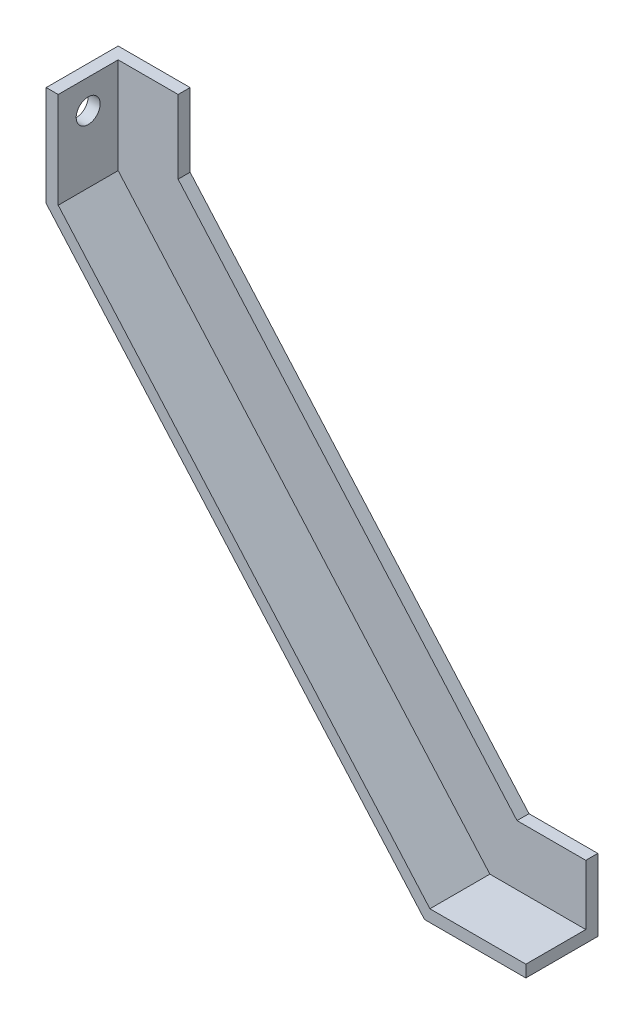
ISO-10303-21;
HEADER;
FILE_DESCRIPTION(('STEP AP214'),'2;1');
FILE_NAME('part.step','',(''),(''),'','','');
FILE_SCHEMA(('AUTOMOTIVE_DESIGN { 1 0 10303 214 1 1 1 1 }'));
ENDSEC;
DATA;
#1=APPLICATION_CONTEXT('core data for automotive mechanical design processes');
#2=APPLICATION_PROTOCOL_DEFINITION('international standard','automotive_design',2000,#1);
#3=PRODUCT_CONTEXT('',#1,'mechanical');
#4=PRODUCT('Part','Part','',(#3));
#5=PRODUCT_RELATED_PRODUCT_CATEGORY('part','',(#4));
#6=PRODUCT_DEFINITION_FORMATION('','',#4);
#7=PRODUCT_DEFINITION_CONTEXT('part definition',#1,'design');
#8=PRODUCT_DEFINITION('design','',#6,#7);
#9=PRODUCT_DEFINITION_SHAPE('','',#8);
#10=(LENGTH_UNIT() NAMED_UNIT(*) SI_UNIT(.MILLI.,.METRE.));
#11=(NAMED_UNIT(*) PLANE_ANGLE_UNIT() SI_UNIT($,.RADIAN.));
#12=(NAMED_UNIT(*) SI_UNIT($,.STERADIAN.) SOLID_ANGLE_UNIT());
#13=UNCERTAINTY_MEASURE_WITH_UNIT(LENGTH_MEASURE(1.E-05),#10,'distance_accuracy_value','');
#14=(GEOMETRIC_REPRESENTATION_CONTEXT(3) GLOBAL_UNCERTAINTY_ASSIGNED_CONTEXT((#13)) GLOBAL_UNIT_ASSIGNED_CONTEXT((#10,
#11,#12)) REPRESENTATION_CONTEXT('',''));
#15=CARTESIAN_POINT('',(0.,0.,0.));
#16=DIRECTION('',(0.,0.,1.));
#17=DIRECTION('',(1.,0.,0.));
#18=AXIS2_PLACEMENT_3D('',#15,#16,#17);
#19=CARTESIAN_POINT('',(127.,-137.517505,19.05));
#20=DIRECTION('',(0.,-1.,0.));
#21=DIRECTION('',(1.,0.,0.));
#22=AXIS2_PLACEMENT_3D('',#19,#20,#21);
#23=PLANE('',#22);
#24=DIRECTION('',(1.,0.,0.));
#25=VECTOR('',#24,1.);
#26=CARTESIAN_POINT('',(1.50270768051186E-13,-137.517505,3.175));
#27=LINE('',#26,#25);
#28=CARTESIAN_POINT('',(101.6,-137.517505,3.17500000000001));
#29=VERTEX_POINT('',#28);
#30=CARTESIAN_POINT('',(127.,-137.517505,3.17500000000001));
#31=VERTEX_POINT('',#30);
#32=EDGE_CURVE('E53',#29,#31,#27,.T.);
#33=ORIENTED_EDGE('',*,*,#32,.F.);
#34=DIRECTION('',(0.,0.,-1.));
#35=VECTOR('',#34,1.);
#36=CARTESIAN_POINT('',(101.6,-137.517505,19.05));
#37=LINE('',#36,#35);
#38=CARTESIAN_POINT('',(101.6,-137.517505,19.05));
#39=VERTEX_POINT('',#38);
#40=EDGE_CURVE('E209',#39,#29,#37,.T.);
#41=ORIENTED_EDGE('',*,*,#40,.F.);
#42=DIRECTION('',(-1.,0.,0.));
#43=VECTOR('',#42,1.);
#44=CARTESIAN_POINT('',(127.,-137.517505,19.05));
#45=LINE('',#44,#43);
#46=CARTESIAN_POINT('',(127.,-137.517505,19.05));
#47=VERTEX_POINT('',#46);
#48=EDGE_CURVE('E191',#47,#39,#45,.T.);
#49=ORIENTED_EDGE('',*,*,#48,.F.);
#50=DIRECTION('',(0.,0.,-1.));
#51=VECTOR('',#50,1.);
#52=CARTESIAN_POINT('',(127.,-137.517505,19.05));
#53=LINE('',#52,#51);
#54=EDGE_CURVE('E49',#47,#31,#53,.T.);
#55=ORIENTED_EDGE('',*,*,#54,.T.);
#56=EDGE_LOOP('',(#33,#41,#49,#55));
#57=FACE_BOUND('',#56,.T.);
#58=ADVANCED_FACE('F34',(#57),#23,.F.);
#59=CARTESIAN_POINT('',(101.6,-137.517505,19.05));
#60=DIRECTION('',(-0.751505485627988,-0.659726841254046,0.));
#61=DIRECTION('',(0.659726841254046,-0.751505485627988,0.));
#62=AXIS2_PLACEMENT_3D('',#59,#60,#61);
#63=PLANE('',#62);
#64=DIRECTION('',(0.659726841254046,-0.751505485627988,0.));
#65=VECTOR('',#64,1.);
#66=CARTESIAN_POINT('',(-10.799909270149,-9.48095544861091,3.175));
#67=LINE('',#66,#65);
#68=CARTESIAN_POINT('',(3.175,-25.4,3.17500000000001));
#69=VERTEX_POINT('',#68);
#70=EDGE_CURVE('E164',#69,#29,#67,.T.);
#71=ORIENTED_EDGE('',*,*,#70,.F.);
#72=DIRECTION('',(0.,0.,-1.));
#73=VECTOR('',#72,1.);
#74=CARTESIAN_POINT('',(3.175,-25.4,19.05));
#75=LINE('',#74,#73);
#76=CARTESIAN_POINT('',(3.175,-25.4,19.05));
#77=VERTEX_POINT('',#76);
#78=EDGE_CURVE('E206',#77,#69,#75,.T.);
#79=ORIENTED_EDGE('',*,*,#78,.F.);
#80=DIRECTION('',(-0.659726841254046,0.751505485627988,0.));
#81=VECTOR('',#80,1.);
#82=CARTESIAN_POINT('',(101.6,-137.517505,19.05));
#83=LINE('',#82,#81);
#84=EDGE_CURVE('E193',#39,#77,#83,.T.);
#85=ORIENTED_EDGE('',*,*,#84,.F.);
#86=ORIENTED_EDGE('',*,*,#40,.T.);
#87=EDGE_LOOP('',(#71,#79,#85,#86));
#88=FACE_BOUND('',#87,.T.);
#89=ADVANCED_FACE('F252',(#88),#63,.F.);
#90=CARTESIAN_POINT('',(3.175,-25.4,19.05));
#91=DIRECTION('',(-1.,0.,0.));
#92=DIRECTION('',(0.,-1.,0.));
#93=AXIS2_PLACEMENT_3D('',#90,#91,#92);
#94=PLANE('',#93);
#95=CARTESIAN_POINT('',(3.175,-7.690689216,11.1125));
#96=DIRECTION('',(1.,0.,0.));
#97=DIRECTION('',(0.,1.,0.));
#98=AXIS2_PLACEMENT_3D('',#95,#96,#97);
#99=CIRCLE('',#98,3.175);
#100=CARTESIAN_POINT('',(3.175,-4.515689216,11.1125));
#101=VERTEX_POINT('',#100);
#102=EDGE_CURVE('E155',#101,#101,#99,.T.);
#103=ORIENTED_EDGE('',*,*,#102,.F.);
#104=EDGE_LOOP('',(#103));
#105=FACE_BOUND('',#104,.T.);
#106=DIRECTION('',(0.,-1.,0.));
#107=VECTOR('',#106,1.);
#108=CARTESIAN_POINT('',(3.175,0.,3.175));
#109=LINE('',#108,#107);
#110=CARTESIAN_POINT('',(3.175,0.,3.17500000000001));
#111=VERTEX_POINT('',#110);
#112=EDGE_CURVE('E144',#111,#69,#109,.T.);
#113=ORIENTED_EDGE('',*,*,#112,.F.);
#114=DIRECTION('',(0.,0.,-1.));
#115=VECTOR('',#114,1.);
#116=CARTESIAN_POINT('',(3.175,0.,19.05));
#117=LINE('',#116,#115);
#118=CARTESIAN_POINT('',(3.175,0.,19.05));
#119=VERTEX_POINT('',#118);
#120=EDGE_CURVE('E149',#119,#111,#117,.T.);
#121=ORIENTED_EDGE('',*,*,#120,.F.);
#122=DIRECTION('',(0.,1.,0.));
#123=VECTOR('',#122,1.);
#124=CARTESIAN_POINT('',(3.175,-25.4,19.05));
#125=LINE('',#124,#123);
#126=EDGE_CURVE('E195',#77,#119,#125,.T.);
#127=ORIENTED_EDGE('',*,*,#126,.F.);
#128=ORIENTED_EDGE('',*,*,#78,.T.);
#129=EDGE_LOOP('',(#113,#121,#127,#128));
#130=FACE_BOUND('',#129,.T.);
#131=ADVANCED_FACE('F256',(#105,#130),#94,.F.);
#132=CARTESIAN_POINT('',(3.175,0.,19.05));
#133=DIRECTION('',(0.,-1.,0.));
#134=DIRECTION('',(0.,0.,-1.));
#135=AXIS2_PLACEMENT_3D('',#132,#133,#134);
#136=PLANE('',#135);
#137=DIRECTION('',(-1.,0.,0.));
#138=VECTOR('',#137,1.);
#139=CARTESIAN_POINT('',(3.175,0.,0.));
#140=LINE('',#139,#138);
#141=CARTESIAN_POINT('',(19.05,0.,0.));
#142=VERTEX_POINT('',#141);
#143=CARTESIAN_POINT('',(0.,0.,0.));
#144=VERTEX_POINT('',#143);
#145=EDGE_CURVE('E174',#142,#144,#140,.T.);
#146=ORIENTED_EDGE('',*,*,#145,.T.);
#147=DIRECTION('',(0.,0.,-1.));
#148=VECTOR('',#147,1.);
#149=CARTESIAN_POINT('',(0.,0.,19.05));
#150=LINE('',#149,#148);
#151=CARTESIAN_POINT('',(0.,0.,19.05));
#152=VERTEX_POINT('',#151);
#153=EDGE_CURVE('E11',#152,#144,#150,.T.);
#154=ORIENTED_EDGE('',*,*,#153,.F.);
#155=DIRECTION('',(-1.,0.,0.));
#156=VECTOR('',#155,1.);
#157=CARTESIAN_POINT('',(3.175,0.,19.05));
#158=LINE('',#157,#156);
#159=EDGE_CURVE('E179',#119,#152,#158,.T.);
#160=ORIENTED_EDGE('',*,*,#159,.F.);
#161=ORIENTED_EDGE('',*,*,#120,.T.);
#162=DIRECTION('',(-1.,0.,0.));
#163=VECTOR('',#162,1.);
#164=CARTESIAN_POINT('',(0.,0.,3.175));
#165=LINE('',#164,#163);
#166=CARTESIAN_POINT('',(19.05,0.,3.175));
#167=VERTEX_POINT('',#166);
#168=EDGE_CURVE('E128',#167,#111,#165,.T.);
#169=ORIENTED_EDGE('',*,*,#168,.F.);
#170=DIRECTION('',(0.,0.,-1.));
#171=VECTOR('',#170,1.);
#172=CARTESIAN_POINT('',(19.05,0.,3.175));
#173=LINE('',#172,#171);
#174=EDGE_CURVE('E137',#167,#142,#173,.T.);
#175=ORIENTED_EDGE('',*,*,#174,.T.);
#176=EDGE_LOOP('',(#146,#154,#160,#161,#169,#175));
#177=FACE_BOUND('',#176,.T.);
#178=ADVANCED_FACE('F36',(#177),#136,.F.);
#179=CARTESIAN_POINT('',(0.,0.,19.05));
#180=DIRECTION('',(1.,0.,0.));
#181=DIRECTION('',(0.,1.,0.));
#182=AXIS2_PLACEMENT_3D('',#179,#180,#181);
#183=PLANE('',#182);
#184=CARTESIAN_POINT('',(0.,-7.690689216,11.1125));
#185=DIRECTION('',(1.,0.,0.));
#186=DIRECTION('',(0.,1.,0.));
#187=AXIS2_PLACEMENT_3D('',#184,#185,#186);
#188=CIRCLE('',#187,3.175);
#189=CARTESIAN_POINT('',(0.,-4.515689216,11.1125));
#190=VERTEX_POINT('',#189);
#191=EDGE_CURVE('E169',#190,#190,#188,.T.);
#192=ORIENTED_EDGE('',*,*,#191,.T.);
#193=EDGE_LOOP('',(#192));
#194=FACE_BOUND('',#193,.T.);
#195=DIRECTION('',(0.,-1.,0.));
#196=VECTOR('',#195,1.);
#197=CARTESIAN_POINT('',(0.,0.,0.));
#198=LINE('',#197,#196);
#199=CARTESIAN_POINT('',(0.,-26.595904173962,0.));
#200=VERTEX_POINT('',#199);
#201=EDGE_CURVE('E198',#144,#200,#198,.T.);
#202=ORIENTED_EDGE('',*,*,#201,.T.);
#203=DIRECTION('',(0.,0.,-1.));
#204=VECTOR('',#203,1.);
#205=CARTESIAN_POINT('',(0.,-26.595904173962,19.05));
#206=LINE('',#205,#204);
#207=CARTESIAN_POINT('',(0.,-26.595904173962,19.05));
#208=VERTEX_POINT('',#207);
#209=EDGE_CURVE('E42',#208,#200,#206,.T.);
#210=ORIENTED_EDGE('',*,*,#209,.F.);
#211=DIRECTION('',(0.,-1.,0.));
#212=VECTOR('',#211,1.);
#213=CARTESIAN_POINT('',(0.,0.,19.05));
#214=LINE('',#213,#212);
#215=EDGE_CURVE('E182',#152,#208,#214,.T.);
#216=ORIENTED_EDGE('',*,*,#215,.F.);
#217=ORIENTED_EDGE('',*,*,#153,.T.);
#218=EDGE_LOOP('',(#202,#210,#216,#217));
#219=FACE_BOUND('',#218,.T.);
#220=ADVANCED_FACE('F242',(#194,#219),#183,.F.);
#221=CARTESIAN_POINT('',(0.,-26.595904173962,19.05));
#222=DIRECTION('',(0.751505485627988,0.659726841254046,0.));
#223=DIRECTION('',(-0.659726841254046,0.751505485627988,0.));
#224=AXIS2_PLACEMENT_3D('',#221,#222,#223);
#225=PLANE('',#224);
#226=DIRECTION('',(0.659726841254046,-0.751505485627988,0.));
#227=VECTOR('',#226,1.);
#228=CARTESIAN_POINT('',(0.,-26.595904173962,0.));
#229=LINE('',#228,#227);
#230=CARTESIAN_POINT('',(100.162396017489,-140.692505,0.));
#231=VERTEX_POINT('',#230);
#232=EDGE_CURVE('E200',#200,#231,#229,.T.);
#233=ORIENTED_EDGE('',*,*,#232,.T.);
#234=DIRECTION('',(0.,0.,-1.));
#235=VECTOR('',#234,1.);
#236=CARTESIAN_POINT('',(100.162396017489,-140.692505,19.05));
#237=LINE('',#236,#235);
#238=CARTESIAN_POINT('',(100.162396017489,-140.692505,19.05));
#239=VERTEX_POINT('',#238);
#240=EDGE_CURVE('E215',#239,#231,#237,.T.);
#241=ORIENTED_EDGE('',*,*,#240,.F.);
#242=DIRECTION('',(0.659726841254046,-0.751505485627988,0.));
#243=VECTOR('',#242,1.);
#244=CARTESIAN_POINT('',(0.,-26.595904173962,19.05));
#245=LINE('',#244,#243);
#246=EDGE_CURVE('E185',#208,#239,#245,.T.);
#247=ORIENTED_EDGE('',*,*,#246,.F.);
#248=ORIENTED_EDGE('',*,*,#209,.T.);
#249=EDGE_LOOP('',(#233,#241,#247,#248));
#250=FACE_BOUND('',#249,.T.);
#251=ADVANCED_FACE('F222',(#250),#225,.F.);
#252=CARTESIAN_POINT('',(100.162396017489,-140.692505,19.05));
#253=DIRECTION('',(0.,1.,0.));
#254=DIRECTION('',(0.,0.,1.));
#255=AXIS2_PLACEMENT_3D('',#252,#253,#254);
#256=PLANE('',#255);
#257=DIRECTION('',(1.,0.,0.));
#258=VECTOR('',#257,1.);
#259=CARTESIAN_POINT('',(100.162396017489,-140.692505,0.));
#260=LINE('',#259,#258);
#261=CARTESIAN_POINT('',(127.,-140.692505,0.));
#262=VERTEX_POINT('',#261);
#263=EDGE_CURVE('E202',#231,#262,#260,.T.);
#264=ORIENTED_EDGE('',*,*,#263,.T.);
#265=DIRECTION('',(0.,0.,-1.));
#266=VECTOR('',#265,1.);
#267=CARTESIAN_POINT('',(127.,-140.692505,19.05));
#268=LINE('',#267,#266);
#269=CARTESIAN_POINT('',(127.,-140.692505,19.05));
#270=VERTEX_POINT('',#269);
#271=EDGE_CURVE('E212',#270,#262,#268,.T.);
#272=ORIENTED_EDGE('',*,*,#271,.F.);
#273=DIRECTION('',(1.,0.,0.));
#274=VECTOR('',#273,1.);
#275=CARTESIAN_POINT('',(100.162396017489,-140.692505,19.05));
#276=LINE('',#275,#274);
#277=EDGE_CURVE('E187',#239,#270,#276,.T.);
#278=ORIENTED_EDGE('',*,*,#277,.F.);
#279=ORIENTED_EDGE('',*,*,#240,.T.);
#280=EDGE_LOOP('',(#264,#272,#278,#279));
#281=FACE_BOUND('',#280,.T.);
#282=ADVANCED_FACE('F232',(#281),#256,.F.);
#283=CARTESIAN_POINT('',(127.,-140.692505,19.05));
#284=DIRECTION('',(-1.,0.,0.));
#285=DIRECTION('',(0.,0.,1.));
#286=AXIS2_PLACEMENT_3D('',#283,#284,#285);
#287=PLANE('',#286);
#288=DIRECTION('',(0.,1.,0.));
#289=VECTOR('',#288,1.);
#290=CARTESIAN_POINT('',(127.,-140.692505,0.));
#291=LINE('',#290,#289);
#292=CARTESIAN_POINT('',(127.,-121.642505,0.));
#293=VERTEX_POINT('',#292);
#294=EDGE_CURVE('E183',#262,#293,#291,.T.);
#295=ORIENTED_EDGE('',*,*,#294,.T.);
#296=DIRECTION('',(0.,0.,-1.));
#297=VECTOR('',#296,1.);
#298=CARTESIAN_POINT('',(127.,-121.642505,3.175));
#299=LINE('',#298,#297);
#300=CARTESIAN_POINT('',(127.,-121.642505,3.175));
#301=VERTEX_POINT('',#300);
#302=EDGE_CURVE('E171',#301,#293,#299,.T.);
#303=ORIENTED_EDGE('',*,*,#302,.F.);
#304=DIRECTION('',(0.,1.,0.));
#305=VECTOR('',#304,1.);
#306=CARTESIAN_POINT('',(127.,0.,3.175));
#307=LINE('',#306,#305);
#308=EDGE_CURVE('E161',#31,#301,#307,.T.);
#309=ORIENTED_EDGE('',*,*,#308,.F.);
#310=ORIENTED_EDGE('',*,*,#54,.F.);
#311=DIRECTION('',(0.,1.,0.));
#312=VECTOR('',#311,1.);
#313=CARTESIAN_POINT('',(127.,-140.692505,19.05));
#314=LINE('',#313,#312);
#315=EDGE_CURVE('E189',#270,#47,#314,.T.);
#316=ORIENTED_EDGE('',*,*,#315,.F.);
#317=ORIENTED_EDGE('',*,*,#271,.T.);
#318=EDGE_LOOP('',(#295,#303,#309,#310,#316,#317));
#319=FACE_BOUND('',#318,.T.);
#320=ADVANCED_FACE('F236',(#319),#287,.F.);
#321=CARTESIAN_POINT('',(0.,0.,19.05));
#322=DIRECTION('',(0.,0.,1.));
#323=DIRECTION('',(1.,0.,0.));
#324=AXIS2_PLACEMENT_3D('',#321,#322,#323);
#325=PLANE('',#324);
#326=ORIENTED_EDGE('',*,*,#159,.T.);
#327=ORIENTED_EDGE('',*,*,#215,.T.);
#328=ORIENTED_EDGE('',*,*,#246,.T.);
#329=ORIENTED_EDGE('',*,*,#277,.T.);
#330=ORIENTED_EDGE('',*,*,#315,.T.);
#331=ORIENTED_EDGE('',*,*,#48,.T.);
#332=ORIENTED_EDGE('',*,*,#84,.T.);
#333=ORIENTED_EDGE('',*,*,#126,.T.);
#334=EDGE_LOOP('',(#326,#327,#328,#329,#330,#331,#332,#333));
#335=FACE_BOUND('',#334,.T.);
#336=ADVANCED_FACE('F240',(#335),#325,.T.);
#337=CARTESIAN_POINT('',(0.,0.,0.));
#338=DIRECTION('',(0.,0.,1.));
#339=DIRECTION('',(1.,0.,0.));
#340=AXIS2_PLACEMENT_3D('',#337,#338,#339);
#341=PLANE('',#340);
#342=ORIENTED_EDGE('',*,*,#145,.F.);
#343=DIRECTION('',(0.,1.,0.));
#344=VECTOR('',#343,1.);
#345=CARTESIAN_POINT('',(19.05,0.,0.));
#346=LINE('',#345,#344);
#347=CARTESIAN_POINT('',(19.05,-19.420479130185,0.));
#348=VERTEX_POINT('',#347);
#349=EDGE_CURVE('E140',#348,#142,#346,.T.);
#350=ORIENTED_EDGE('',*,*,#349,.F.);
#351=DIRECTION('',(-0.659726841254046,0.751505485627988,0.));
#352=VECTOR('',#351,1.);
#353=CARTESIAN_POINT('',(1.13024031419536,0.992208156297076,0.));
#354=LINE('',#353,#352);
#355=CARTESIAN_POINT('',(108.78801991256,-121.642505,0.));
#356=VERTEX_POINT('',#355);
#357=EDGE_CURVE('E152',#356,#348,#354,.T.);
#358=ORIENTED_EDGE('',*,*,#357,.F.);
#359=DIRECTION('',(-1.,0.,0.));
#360=VECTOR('',#359,1.);
#361=CARTESIAN_POINT('',(0.,-121.642505,0.));
#362=LINE('',#361,#360);
#363=EDGE_CURVE('E150',#293,#356,#362,.T.);
#364=ORIENTED_EDGE('',*,*,#363,.F.);
#365=ORIENTED_EDGE('',*,*,#294,.F.);
#366=ORIENTED_EDGE('',*,*,#263,.F.);
#367=ORIENTED_EDGE('',*,*,#232,.F.);
#368=ORIENTED_EDGE('',*,*,#201,.F.);
#369=EDGE_LOOP('',(#342,#350,#358,#364,#365,#366,#367,#368));
#370=FACE_BOUND('',#369,.T.);
#371=ADVANCED_FACE('F227',(#370),#341,.F.);
#372=CARTESIAN_POINT('',(0.,-121.642505,3.175));
#373=DIRECTION('',(0.,-1.,0.));
#374=DIRECTION('',(0.,0.,-1.));
#375=AXIS2_PLACEMENT_3D('',#372,#373,#374);
#376=PLANE('',#375);
#377=ORIENTED_EDGE('',*,*,#363,.T.);
#378=DIRECTION('',(0.,0.,-1.));
#379=VECTOR('',#378,1.);
#380=CARTESIAN_POINT('',(108.78801991256,-121.642505,3.175));
#381=LINE('',#380,#379);
#382=CARTESIAN_POINT('',(108.78801991256,-121.642505,3.175));
#383=VERTEX_POINT('',#382);
#384=EDGE_CURVE('E175',#383,#356,#381,.T.);
#385=ORIENTED_EDGE('',*,*,#384,.F.);
#386=DIRECTION('',(-1.,0.,0.));
#387=VECTOR('',#386,1.);
#388=CARTESIAN_POINT('',(0.,-121.642505,3.175));
#389=LINE('',#388,#387);
#390=EDGE_CURVE('E159',#301,#383,#389,.T.);
#391=ORIENTED_EDGE('',*,*,#390,.F.);
#392=ORIENTED_EDGE('',*,*,#302,.T.);
#393=EDGE_LOOP('',(#377,#385,#391,#392));
#394=FACE_BOUND('',#393,.T.);
#395=ADVANCED_FACE('F249',(#394),#376,.F.);
#396=CARTESIAN_POINT('',(1.13024031419536,0.992208156297076,3.175));
#397=DIRECTION('',(-0.751505485627988,-0.659726841254046,0.));
#398=DIRECTION('',(0.659726841254046,-0.751505485627988,0.));
#399=AXIS2_PLACEMENT_3D('',#396,#397,#398);
#400=PLANE('',#399);
#401=ORIENTED_EDGE('',*,*,#357,.T.);
#402=DIRECTION('',(0.,0.,-1.));
#403=VECTOR('',#402,1.);
#404=CARTESIAN_POINT('',(19.05,-19.420479130185,3.175));
#405=LINE('',#404,#403);
#406=CARTESIAN_POINT('',(19.05,-19.420479130185,3.175));
#407=VERTEX_POINT('',#406);
#408=EDGE_CURVE('E143',#407,#348,#405,.T.);
#409=ORIENTED_EDGE('',*,*,#408,.F.);
#410=DIRECTION('',(-0.659726841254046,0.751505485627988,0.));
#411=VECTOR('',#410,1.);
#412=CARTESIAN_POINT('',(1.13024031419536,0.992208156297076,3.175));
#413=LINE('',#412,#411);
#414=EDGE_CURVE('E130',#383,#407,#413,.T.);
#415=ORIENTED_EDGE('',*,*,#414,.F.);
#416=ORIENTED_EDGE('',*,*,#384,.T.);
#417=EDGE_LOOP('',(#401,#409,#415,#416));
#418=FACE_BOUND('',#417,.T.);
#419=ADVANCED_FACE('F245',(#418),#400,.F.);
#420=CARTESIAN_POINT('',(19.05,0.,3.175));
#421=DIRECTION('',(-1.,0.,0.));
#422=DIRECTION('',(0.,-1.,0.));
#423=AXIS2_PLACEMENT_3D('',#420,#421,#422);
#424=PLANE('',#423);
#425=ORIENTED_EDGE('',*,*,#349,.T.);
#426=ORIENTED_EDGE('',*,*,#174,.F.);
#427=DIRECTION('',(0.,1.,0.));
#428=VECTOR('',#427,1.);
#429=CARTESIAN_POINT('',(19.05,0.,3.175));
#430=LINE('',#429,#428);
#431=EDGE_CURVE('E123',#407,#167,#430,.T.);
#432=ORIENTED_EDGE('',*,*,#431,.F.);
#433=ORIENTED_EDGE('',*,*,#408,.T.);
#434=EDGE_LOOP('',(#425,#426,#432,#433));
#435=FACE_BOUND('',#434,.T.);
#436=ADVANCED_FACE('F138',(#435),#424,.F.);
#437=CARTESIAN_POINT('',(0.,0.,3.175));
#438=DIRECTION('',(0.,0.,-1.));
#439=DIRECTION('',(-1.,0.,0.));
#440=AXIS2_PLACEMENT_3D('',#437,#438,#439);
#441=PLANE('',#440);
#442=ORIENTED_EDGE('',*,*,#168,.T.);
#443=ORIENTED_EDGE('',*,*,#112,.T.);
#444=ORIENTED_EDGE('',*,*,#70,.T.);
#445=ORIENTED_EDGE('',*,*,#32,.T.);
#446=ORIENTED_EDGE('',*,*,#308,.T.);
#447=ORIENTED_EDGE('',*,*,#390,.T.);
#448=ORIENTED_EDGE('',*,*,#414,.T.);
#449=ORIENTED_EDGE('',*,*,#431,.T.);
#450=EDGE_LOOP('',(#442,#443,#444,#445,#446,#447,#448,#449));
#451=FACE_BOUND('',#450,.T.);
#452=ADVANCED_FACE('F125',(#451),#441,.F.);
#453=CARTESIAN_POINT('',(0.,-7.690689216,11.1125));
#454=DIRECTION('',(1.,0.,0.));
#455=DIRECTION('',(0.,1.,0.));
#456=AXIS2_PLACEMENT_3D('',#453,#454,#455);
#457=CYLINDRICAL_SURFACE('',#456,3.175);
#458=ORIENTED_EDGE('',*,*,#191,.F.);
#459=EDGE_LOOP('',(#458));
#460=FACE_BOUND('',#459,.T.);
#461=ORIENTED_EDGE('',*,*,#102,.T.);
#462=EDGE_LOOP('',(#461));
#463=FACE_BOUND('',#462,.T.);
#464=ADVANCED_FACE('F286',(#460,#463),#457,.F.);
#465=CLOSED_SHELL('',(#58,#89,#131,#178,#220,#251,#282,#320,#336,#371,#395,#419,#436,#452,#464));
#466=MANIFOLD_SOLID_BREP('B2',#465);
#467=ADVANCED_BREP_SHAPE_REPRESENTATION('',(#18,#466),#14);
#468=SHAPE_DEFINITION_REPRESENTATION(#9,#467);
ENDSEC;
END-ISO-10303-21;
